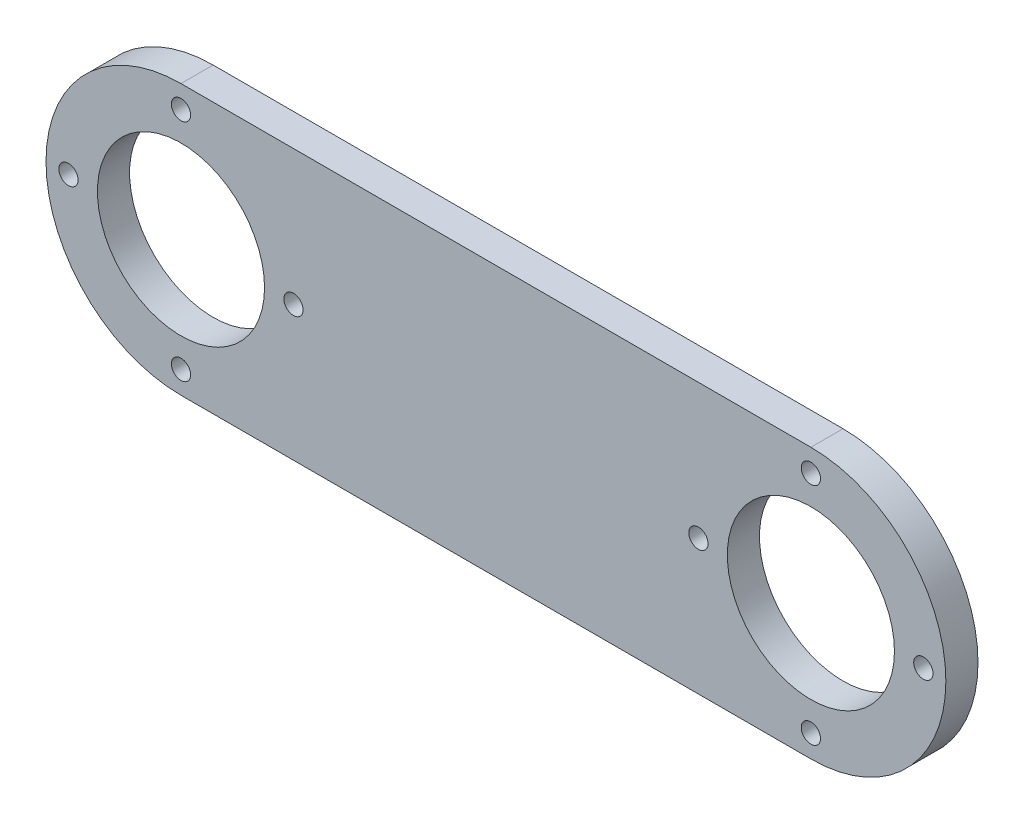
ISO-10303-21;
HEADER;
FILE_DESCRIPTION(('STEP AP214'),'2;1');
FILE_NAME('part.step','',(''),(''),'','','');
FILE_SCHEMA(('AUTOMOTIVE_DESIGN { 1 0 10303 214 1 1 1 1 }'));
ENDSEC;
DATA;
#1=APPLICATION_CONTEXT('core data for automotive mechanical design processes');
#2=APPLICATION_PROTOCOL_DEFINITION('international standard','automotive_design',2000,#1);
#3=PRODUCT_CONTEXT('',#1,'mechanical');
#4=PRODUCT('Part','Part','',(#3));
#5=PRODUCT_RELATED_PRODUCT_CATEGORY('part','',(#4));
#6=PRODUCT_DEFINITION_FORMATION('','',#4);
#7=PRODUCT_DEFINITION_CONTEXT('part definition',#1,'design');
#8=PRODUCT_DEFINITION('design','',#6,#7);
#9=PRODUCT_DEFINITION_SHAPE('','',#8);
#10=(LENGTH_UNIT() NAMED_UNIT(*) SI_UNIT(.MILLI.,.METRE.));
#11=(NAMED_UNIT(*) PLANE_ANGLE_UNIT() SI_UNIT($,.RADIAN.));
#12=(NAMED_UNIT(*) SI_UNIT($,.STERADIAN.) SOLID_ANGLE_UNIT());
#13=UNCERTAINTY_MEASURE_WITH_UNIT(LENGTH_MEASURE(1.E-05),#10,'distance_accuracy_value','');
#14=(GEOMETRIC_REPRESENTATION_CONTEXT(3) GLOBAL_UNCERTAINTY_ASSIGNED_CONTEXT((#13)) GLOBAL_UNIT_ASSIGNED_CONTEXT((#10,
#11,#12)) REPRESENTATION_CONTEXT('',''));
#15=CARTESIAN_POINT('',(0.,0.,0.));
#16=DIRECTION('',(0.,0.,1.));
#17=DIRECTION('',(1.,0.,0.));
#18=AXIS2_PLACEMENT_3D('',#15,#16,#17);
#19=CARTESIAN_POINT('',(-49.,4.99999999999989,5.));
#20=DIRECTION('',(0.,0.,1.));
#21=DIRECTION('',(1.,0.,0.));
#22=AXIS2_PLACEMENT_3D('',#19,#20,#21);
#23=PLANE('',#22);
#24=CARTESIAN_POINT('',(-49.,4.99999999999989,5.));
#25=DIRECTION('',(0.,0.,1.));
#26=DIRECTION('',(1.,0.,0.));
#27=AXIS2_PLACEMENT_3D('',#24,#25,#26);
#28=CIRCLE('',#27,13.0000000000001);
#29=CARTESIAN_POINT('',(-36.,4.99999999999989,5.));
#30=VERTEX_POINT('',#29);
#31=EDGE_CURVE('E190',#30,#30,#28,.T.);
#32=ORIENTED_EDGE('',*,*,#31,.F.);
#33=EDGE_LOOP('',(#32));
#34=FACE_BOUND('',#33,.T.);
#35=CARTESIAN_POINT('',(-66.5,5.,5.));
#36=DIRECTION('',(0.,0.,1.));
#37=DIRECTION('',(1.,0.,0.));
#38=AXIS2_PLACEMENT_3D('',#35,#36,#37);
#39=CIRCLE('',#38,1.5);
#40=CARTESIAN_POINT('',(-65.,5.,5.));
#41=VERTEX_POINT('',#40);
#42=EDGE_CURVE('E174',#41,#41,#39,.T.);
#43=ORIENTED_EDGE('',*,*,#42,.F.);
#44=EDGE_LOOP('',(#43));
#45=FACE_BOUND('',#44,.T.);
#46=CARTESIAN_POINT('',(-49.,-12.5,5.));
#47=DIRECTION('',(0.,0.,1.));
#48=DIRECTION('',(1.,0.,0.));
#49=AXIS2_PLACEMENT_3D('',#46,#47,#48);
#50=CIRCLE('',#49,1.5);
#51=CARTESIAN_POINT('',(-47.5,-12.5,5.));
#52=VERTEX_POINT('',#51);
#53=EDGE_CURVE('E158',#52,#52,#50,.T.);
#54=ORIENTED_EDGE('',*,*,#53,.F.);
#55=EDGE_LOOP('',(#54));
#56=FACE_BOUND('',#55,.T.);
#57=CARTESIAN_POINT('',(31.5,5.,5.));
#58=DIRECTION('',(0.,0.,1.));
#59=DIRECTION('',(1.,0.,0.));
#60=AXIS2_PLACEMENT_3D('',#57,#58,#59);
#61=CIRCLE('',#60,1.5);
#62=CARTESIAN_POINT('',(33.,5.,5.));
#63=VERTEX_POINT('',#62);
#64=EDGE_CURVE('E142',#63,#63,#61,.T.);
#65=ORIENTED_EDGE('',*,*,#64,.F.);
#66=EDGE_LOOP('',(#65));
#67=FACE_BOUND('',#66,.T.);
#68=CARTESIAN_POINT('',(49.,-12.5,5.));
#69=DIRECTION('',(0.,0.,1.));
#70=DIRECTION('',(1.,0.,0.));
#71=AXIS2_PLACEMENT_3D('',#68,#69,#70);
#72=CIRCLE('',#71,1.5);
#73=CARTESIAN_POINT('',(50.5,-12.5,5.));
#74=VERTEX_POINT('',#73);
#75=EDGE_CURVE('E112',#74,#74,#72,.T.);
#76=ORIENTED_EDGE('',*,*,#75,.F.);
#77=EDGE_LOOP('',(#76));
#78=FACE_BOUND('',#77,.T.);
#79=CARTESIAN_POINT('',(-49.,4.99999999999989,5.));
#80=DIRECTION('',(0.,0.,1.));
#81=DIRECTION('',(1.,0.,0.));
#82=AXIS2_PLACEMENT_3D('',#79,#80,#81);
#83=CIRCLE('',#82,21.);
#84=CARTESIAN_POINT('',(-49.,25.9999999999999,5.));
#85=VERTEX_POINT('',#84);
#86=CARTESIAN_POINT('',(-49.,-16.0000000000001,5.));
#87=VERTEX_POINT('',#86);
#88=EDGE_CURVE('E92',#85,#87,#83,.T.);
#89=ORIENTED_EDGE('',*,*,#88,.T.);
#90=DIRECTION('',(1.,0.,0.));
#91=VECTOR('',#90,1.);
#92=CARTESIAN_POINT('',(-49.,-16.0000000000001,5.));
#93=LINE('',#92,#91);
#94=CARTESIAN_POINT('',(49.,-16.,5.));
#95=VERTEX_POINT('',#94);
#96=EDGE_CURVE('E87',#87,#95,#93,.T.);
#97=ORIENTED_EDGE('',*,*,#96,.T.);
#98=CARTESIAN_POINT('',(49.,5.,5.));
#99=DIRECTION('',(0.,0.,1.));
#100=DIRECTION('',(1.,0.,0.));
#101=AXIS2_PLACEMENT_3D('',#98,#99,#100);
#102=CIRCLE('',#101,21.);
#103=CARTESIAN_POINT('',(49.,26.,5.));
#104=VERTEX_POINT('',#103);
#105=EDGE_CURVE('E90',#95,#104,#102,.T.);
#106=ORIENTED_EDGE('',*,*,#105,.T.);
#107=DIRECTION('',(-1.,0.,0.));
#108=VECTOR('',#107,1.);
#109=CARTESIAN_POINT('',(-49.,25.9999999999999,5.));
#110=LINE('',#109,#108);
#111=EDGE_CURVE('E57',#104,#85,#110,.T.);
#112=ORIENTED_EDGE('',*,*,#111,.T.);
#113=EDGE_LOOP('',(#89,#97,#106,#112));
#114=FACE_BOUND('',#113,.T.);
#115=CARTESIAN_POINT('',(66.5,5.,5.));
#116=DIRECTION('',(0.,0.,1.));
#117=DIRECTION('',(1.,0.,0.));
#118=AXIS2_PLACEMENT_3D('',#115,#116,#117);
#119=CIRCLE('',#118,1.5);
#120=CARTESIAN_POINT('',(68.,5.,5.));
#121=VERTEX_POINT('',#120);
#122=EDGE_CURVE('E134',#121,#121,#119,.T.);
#123=ORIENTED_EDGE('',*,*,#122,.F.);
#124=EDGE_LOOP('',(#123));
#125=FACE_BOUND('',#124,.T.);
#126=CARTESIAN_POINT('',(49.,22.5,5.));
#127=DIRECTION('',(0.,0.,1.));
#128=DIRECTION('',(1.,0.,0.));
#129=AXIS2_PLACEMENT_3D('',#126,#127,#128);
#130=CIRCLE('',#129,1.5);
#131=CARTESIAN_POINT('',(50.5,22.5,5.));
#132=VERTEX_POINT('',#131);
#133=EDGE_CURVE('E150',#132,#132,#130,.T.);
#134=ORIENTED_EDGE('',*,*,#133,.F.);
#135=EDGE_LOOP('',(#134));
#136=FACE_BOUND('',#135,.T.);
#137=CARTESIAN_POINT('',(-31.5,5.,5.));
#138=DIRECTION('',(0.,0.,1.));
#139=DIRECTION('',(1.,0.,0.));
#140=AXIS2_PLACEMENT_3D('',#137,#138,#139);
#141=CIRCLE('',#140,1.5);
#142=CARTESIAN_POINT('',(-30.,5.,5.));
#143=VERTEX_POINT('',#142);
#144=EDGE_CURVE('E166',#143,#143,#141,.T.);
#145=ORIENTED_EDGE('',*,*,#144,.F.);
#146=EDGE_LOOP('',(#145));
#147=FACE_BOUND('',#146,.T.);
#148=CARTESIAN_POINT('',(-49.,22.5,5.));
#149=DIRECTION('',(0.,0.,1.));
#150=DIRECTION('',(1.,0.,0.));
#151=AXIS2_PLACEMENT_3D('',#148,#149,#150);
#152=CIRCLE('',#151,1.5);
#153=CARTESIAN_POINT('',(-47.5,22.5,5.));
#154=VERTEX_POINT('',#153);
#155=EDGE_CURVE('E182',#154,#154,#152,.T.);
#156=ORIENTED_EDGE('',*,*,#155,.F.);
#157=EDGE_LOOP('',(#156));
#158=FACE_BOUND('',#157,.T.);
#159=CARTESIAN_POINT('',(49.,5.,5.));
#160=DIRECTION('',(0.,0.,1.));
#161=DIRECTION('',(1.,0.,0.));
#162=AXIS2_PLACEMENT_3D('',#159,#160,#161);
#163=CIRCLE('',#162,13.);
#164=CARTESIAN_POINT('',(62.,5.,5.));
#165=VERTEX_POINT('',#164);
#166=EDGE_CURVE('E198',#165,#165,#163,.T.);
#167=ORIENTED_EDGE('',*,*,#166,.F.);
#168=EDGE_LOOP('',(#167));
#169=FACE_BOUND('',#168,.T.);
#170=ADVANCED_FACE('F39',(#34,#45,#56,#67,#78,#114,#125,#136,#147,#158,#169),#23,.T.);
#171=CARTESIAN_POINT('',(-49.,4.99999999999989,0.));
#172=DIRECTION('',(0.,0.,1.));
#173=DIRECTION('',(1.,0.,0.));
#174=AXIS2_PLACEMENT_3D('',#171,#172,#173);
#175=PLANE('',#174);
#176=CARTESIAN_POINT('',(-49.,4.99999999999989,0.));
#177=DIRECTION('',(0.,0.,1.));
#178=DIRECTION('',(1.,0.,0.));
#179=AXIS2_PLACEMENT_3D('',#176,#177,#178);
#180=CIRCLE('',#179,21.);
#181=CARTESIAN_POINT('',(-49.,25.9999999999999,0.));
#182=VERTEX_POINT('',#181);
#183=CARTESIAN_POINT('',(-49.,-16.0000000000001,0.));
#184=VERTEX_POINT('',#183);
#185=EDGE_CURVE('E108',#182,#184,#180,.T.);
#186=ORIENTED_EDGE('',*,*,#185,.F.);
#187=DIRECTION('',(-1.,0.,0.));
#188=VECTOR('',#187,1.);
#189=CARTESIAN_POINT('',(-49.,25.9999999999999,0.));
#190=LINE('',#189,#188);
#191=CARTESIAN_POINT('',(49.,26.,0.));
#192=VERTEX_POINT('',#191);
#193=EDGE_CURVE('E80',#192,#182,#190,.T.);
#194=ORIENTED_EDGE('',*,*,#193,.F.);
#195=CARTESIAN_POINT('',(49.,5.,0.));
#196=DIRECTION('',(0.,0.,1.));
#197=DIRECTION('',(1.,0.,0.));
#198=AXIS2_PLACEMENT_3D('',#195,#196,#197);
#199=CIRCLE('',#198,21.);
#200=CARTESIAN_POINT('',(49.,-16.,0.));
#201=VERTEX_POINT('',#200);
#202=EDGE_CURVE('E74',#201,#192,#199,.T.);
#203=ORIENTED_EDGE('',*,*,#202,.F.);
#204=DIRECTION('',(1.,0.,0.));
#205=VECTOR('',#204,1.);
#206=CARTESIAN_POINT('',(-49.,-16.0000000000001,0.));
#207=LINE('',#206,#205);
#208=EDGE_CURVE('E97',#184,#201,#207,.T.);
#209=ORIENTED_EDGE('',*,*,#208,.F.);
#210=EDGE_LOOP('',(#186,#194,#203,#209));
#211=FACE_BOUND('',#210,.T.);
#212=CARTESIAN_POINT('',(49.,-12.5,0.));
#213=DIRECTION('',(0.,0.,1.));
#214=DIRECTION('',(1.,0.,0.));
#215=AXIS2_PLACEMENT_3D('',#212,#213,#214);
#216=CIRCLE('',#215,1.5);
#217=CARTESIAN_POINT('',(50.5,-12.5,0.));
#218=VERTEX_POINT('',#217);
#219=EDGE_CURVE('E130',#218,#218,#216,.T.);
#220=ORIENTED_EDGE('',*,*,#219,.T.);
#221=EDGE_LOOP('',(#220));
#222=FACE_BOUND('',#221,.T.);
#223=CARTESIAN_POINT('',(66.5,5.,0.));
#224=DIRECTION('',(0.,0.,1.));
#225=DIRECTION('',(1.,0.,0.));
#226=AXIS2_PLACEMENT_3D('',#223,#224,#225);
#227=CIRCLE('',#226,1.5);
#228=CARTESIAN_POINT('',(68.,5.,0.));
#229=VERTEX_POINT('',#228);
#230=EDGE_CURVE('E138',#229,#229,#227,.T.);
#231=ORIENTED_EDGE('',*,*,#230,.T.);
#232=EDGE_LOOP('',(#231));
#233=FACE_BOUND('',#232,.T.);
#234=CARTESIAN_POINT('',(31.5,5.,0.));
#235=DIRECTION('',(0.,0.,1.));
#236=DIRECTION('',(1.,0.,0.));
#237=AXIS2_PLACEMENT_3D('',#234,#235,#236);
#238=CIRCLE('',#237,1.5);
#239=CARTESIAN_POINT('',(33.,5.,0.));
#240=VERTEX_POINT('',#239);
#241=EDGE_CURVE('E146',#240,#240,#238,.T.);
#242=ORIENTED_EDGE('',*,*,#241,.T.);
#243=EDGE_LOOP('',(#242));
#244=FACE_BOUND('',#243,.T.);
#245=CARTESIAN_POINT('',(49.,22.5,0.));
#246=DIRECTION('',(0.,0.,1.));
#247=DIRECTION('',(1.,0.,0.));
#248=AXIS2_PLACEMENT_3D('',#245,#246,#247);
#249=CIRCLE('',#248,1.5);
#250=CARTESIAN_POINT('',(50.5,22.5,0.));
#251=VERTEX_POINT('',#250);
#252=EDGE_CURVE('E154',#251,#251,#249,.T.);
#253=ORIENTED_EDGE('',*,*,#252,.T.);
#254=EDGE_LOOP('',(#253));
#255=FACE_BOUND('',#254,.T.);
#256=CARTESIAN_POINT('',(-49.,-12.5,0.));
#257=DIRECTION('',(0.,0.,1.));
#258=DIRECTION('',(1.,0.,0.));
#259=AXIS2_PLACEMENT_3D('',#256,#257,#258);
#260=CIRCLE('',#259,1.5);
#261=CARTESIAN_POINT('',(-47.5,-12.5,0.));
#262=VERTEX_POINT('',#261);
#263=EDGE_CURVE('E162',#262,#262,#260,.T.);
#264=ORIENTED_EDGE('',*,*,#263,.T.);
#265=EDGE_LOOP('',(#264));
#266=FACE_BOUND('',#265,.T.);
#267=CARTESIAN_POINT('',(-31.5,5.,0.));
#268=DIRECTION('',(0.,0.,1.));
#269=DIRECTION('',(1.,0.,0.));
#270=AXIS2_PLACEMENT_3D('',#267,#268,#269);
#271=CIRCLE('',#270,1.5);
#272=CARTESIAN_POINT('',(-30.,5.,0.));
#273=VERTEX_POINT('',#272);
#274=EDGE_CURVE('E170',#273,#273,#271,.T.);
#275=ORIENTED_EDGE('',*,*,#274,.T.);
#276=EDGE_LOOP('',(#275));
#277=FACE_BOUND('',#276,.T.);
#278=CARTESIAN_POINT('',(-66.5,5.,0.));
#279=DIRECTION('',(0.,0.,1.));
#280=DIRECTION('',(1.,0.,0.));
#281=AXIS2_PLACEMENT_3D('',#278,#279,#280);
#282=CIRCLE('',#281,1.5);
#283=CARTESIAN_POINT('',(-65.,5.,0.));
#284=VERTEX_POINT('',#283);
#285=EDGE_CURVE('E178',#284,#284,#282,.T.);
#286=ORIENTED_EDGE('',*,*,#285,.T.);
#287=EDGE_LOOP('',(#286));
#288=FACE_BOUND('',#287,.T.);
#289=CARTESIAN_POINT('',(-49.,22.5,0.));
#290=DIRECTION('',(0.,0.,1.));
#291=DIRECTION('',(1.,0.,0.));
#292=AXIS2_PLACEMENT_3D('',#289,#290,#291);
#293=CIRCLE('',#292,1.5);
#294=CARTESIAN_POINT('',(-47.5,22.5,0.));
#295=VERTEX_POINT('',#294);
#296=EDGE_CURVE('E186',#295,#295,#293,.T.);
#297=ORIENTED_EDGE('',*,*,#296,.T.);
#298=EDGE_LOOP('',(#297));
#299=FACE_BOUND('',#298,.T.);
#300=CARTESIAN_POINT('',(-49.,4.99999999999989,0.));
#301=DIRECTION('',(0.,0.,1.));
#302=DIRECTION('',(1.,0.,0.));
#303=AXIS2_PLACEMENT_3D('',#300,#301,#302);
#304=CIRCLE('',#303,13.0000000000001);
#305=CARTESIAN_POINT('',(-36.,4.99999999999989,0.));
#306=VERTEX_POINT('',#305);
#307=EDGE_CURVE('E194',#306,#306,#304,.T.);
#308=ORIENTED_EDGE('',*,*,#307,.T.);
#309=EDGE_LOOP('',(#308));
#310=FACE_BOUND('',#309,.T.);
#311=CARTESIAN_POINT('',(49.,5.,0.));
#312=DIRECTION('',(0.,0.,1.));
#313=DIRECTION('',(1.,0.,0.));
#314=AXIS2_PLACEMENT_3D('',#311,#312,#313);
#315=CIRCLE('',#314,13.);
#316=CARTESIAN_POINT('',(62.,5.,0.));
#317=VERTEX_POINT('',#316);
#318=EDGE_CURVE('E202',#317,#317,#315,.T.);
#319=ORIENTED_EDGE('',*,*,#318,.T.);
#320=EDGE_LOOP('',(#319));
#321=FACE_BOUND('',#320,.T.);
#322=ADVANCED_FACE('F125',(#211,#222,#233,#244,#255,#266,#277,#288,#299,#310,#321),#175,.F.);
#323=CARTESIAN_POINT('',(-49.,4.99999999999989,5.));
#324=DIRECTION('',(0.,0.,-1.));
#325=DIRECTION('',(-1.,0.,0.));
#326=AXIS2_PLACEMENT_3D('',#323,#324,#325);
#327=CYLINDRICAL_SURFACE('',#326,21.);
#328=ORIENTED_EDGE('',*,*,#185,.T.);
#329=DIRECTION('',(0.,0.,-1.));
#330=VECTOR('',#329,1.);
#331=CARTESIAN_POINT('',(-49.,-16.0000000000001,5.));
#332=LINE('',#331,#330);
#333=EDGE_CURVE('E11',#87,#184,#332,.T.);
#334=ORIENTED_EDGE('',*,*,#333,.F.);
#335=ORIENTED_EDGE('',*,*,#88,.F.);
#336=DIRECTION('',(0.,0.,-1.));
#337=VECTOR('',#336,1.);
#338=CARTESIAN_POINT('',(-49.,25.9999999999999,5.));
#339=LINE('',#338,#337);
#340=EDGE_CURVE('E104',#85,#182,#339,.T.);
#341=ORIENTED_EDGE('',*,*,#340,.T.);
#342=EDGE_LOOP('',(#328,#334,#335,#341));
#343=FACE_BOUND('',#342,.T.);
#344=ADVANCED_FACE('F41',(#343),#327,.T.);
#345=CARTESIAN_POINT('',(-49.,-16.0000000000001,5.));
#346=DIRECTION('',(0.,1.,0.));
#347=DIRECTION('',(-1.,0.,0.));
#348=AXIS2_PLACEMENT_3D('',#345,#346,#347);
#349=PLANE('',#348);
#350=ORIENTED_EDGE('',*,*,#208,.T.);
#351=DIRECTION('',(0.,0.,-1.));
#352=VECTOR('',#351,1.);
#353=CARTESIAN_POINT('',(49.,-16.,5.));
#354=LINE('',#353,#352);
#355=EDGE_CURVE('E49',#95,#201,#354,.T.);
#356=ORIENTED_EDGE('',*,*,#355,.F.);
#357=ORIENTED_EDGE('',*,*,#96,.F.);
#358=ORIENTED_EDGE('',*,*,#333,.T.);
#359=EDGE_LOOP('',(#350,#356,#357,#358));
#360=FACE_BOUND('',#359,.T.);
#361=ADVANCED_FACE('F96',(#360),#349,.F.);
#362=CARTESIAN_POINT('',(49.,5.,5.));
#363=DIRECTION('',(0.,0.,-1.));
#364=DIRECTION('',(-1.,0.,0.));
#365=AXIS2_PLACEMENT_3D('',#362,#363,#364);
#366=CYLINDRICAL_SURFACE('',#365,21.);
#367=ORIENTED_EDGE('',*,*,#202,.T.);
#368=DIRECTION('',(0.,0.,-1.));
#369=VECTOR('',#368,1.);
#370=CARTESIAN_POINT('',(49.,26.,5.));
#371=LINE('',#370,#369);
#372=EDGE_CURVE('E99',#104,#192,#371,.T.);
#373=ORIENTED_EDGE('',*,*,#372,.F.);
#374=ORIENTED_EDGE('',*,*,#105,.F.);
#375=ORIENTED_EDGE('',*,*,#355,.T.);
#376=EDGE_LOOP('',(#367,#373,#374,#375));
#377=FACE_BOUND('',#376,.T.);
#378=ADVANCED_FACE('F100',(#377),#366,.T.);
#379=CARTESIAN_POINT('',(-49.,25.9999999999999,5.));
#380=DIRECTION('',(0.,-1.,0.));
#381=DIRECTION('',(1.,0.,0.));
#382=AXIS2_PLACEMENT_3D('',#379,#380,#381);
#383=PLANE('',#382);
#384=ORIENTED_EDGE('',*,*,#193,.T.);
#385=ORIENTED_EDGE('',*,*,#340,.F.);
#386=ORIENTED_EDGE('',*,*,#111,.F.);
#387=ORIENTED_EDGE('',*,*,#372,.T.);
#388=EDGE_LOOP('',(#384,#385,#386,#387));
#389=FACE_BOUND('',#388,.T.);
#390=ADVANCED_FACE('F122',(#389),#383,.F.);
#391=CARTESIAN_POINT('',(49.,-12.5,5.));
#392=DIRECTION('',(0.,0.,-1.));
#393=DIRECTION('',(-1.,0.,0.));
#394=AXIS2_PLACEMENT_3D('',#391,#392,#393);
#395=CYLINDRICAL_SURFACE('',#394,1.5);
#396=ORIENTED_EDGE('',*,*,#75,.T.);
#397=EDGE_LOOP('',(#396));
#398=FACE_BOUND('',#397,.T.);
#399=ORIENTED_EDGE('',*,*,#219,.F.);
#400=EDGE_LOOP('',(#399));
#401=FACE_BOUND('',#400,.T.);
#402=ADVANCED_FACE('F223',(#398,#401),#395,.F.);
#403=CARTESIAN_POINT('',(66.5,5.,5.));
#404=DIRECTION('',(0.,0.,-1.));
#405=DIRECTION('',(-1.,0.,0.));
#406=AXIS2_PLACEMENT_3D('',#403,#404,#405);
#407=CYLINDRICAL_SURFACE('',#406,1.5);
#408=ORIENTED_EDGE('',*,*,#122,.T.);
#409=EDGE_LOOP('',(#408));
#410=FACE_BOUND('',#409,.T.);
#411=ORIENTED_EDGE('',*,*,#230,.F.);
#412=EDGE_LOOP('',(#411));
#413=FACE_BOUND('',#412,.T.);
#414=ADVANCED_FACE('F269',(#410,#413),#407,.F.);
#415=CARTESIAN_POINT('',(31.5,5.,5.));
#416=DIRECTION('',(0.,0.,-1.));
#417=DIRECTION('',(-1.,0.,0.));
#418=AXIS2_PLACEMENT_3D('',#415,#416,#417);
#419=CYLINDRICAL_SURFACE('',#418,1.5);
#420=ORIENTED_EDGE('',*,*,#64,.T.);
#421=EDGE_LOOP('',(#420));
#422=FACE_BOUND('',#421,.T.);
#423=ORIENTED_EDGE('',*,*,#241,.F.);
#424=EDGE_LOOP('',(#423));
#425=FACE_BOUND('',#424,.T.);
#426=ADVANCED_FACE('F277',(#422,#425),#419,.F.);
#427=CARTESIAN_POINT('',(49.,22.5,5.));
#428=DIRECTION('',(0.,0.,-1.));
#429=DIRECTION('',(-1.,0.,0.));
#430=AXIS2_PLACEMENT_3D('',#427,#428,#429);
#431=CYLINDRICAL_SURFACE('',#430,1.5);
#432=ORIENTED_EDGE('',*,*,#133,.T.);
#433=EDGE_LOOP('',(#432));
#434=FACE_BOUND('',#433,.T.);
#435=ORIENTED_EDGE('',*,*,#252,.F.);
#436=EDGE_LOOP('',(#435));
#437=FACE_BOUND('',#436,.T.);
#438=ADVANCED_FACE('F285',(#434,#437),#431,.F.);
#439=CARTESIAN_POINT('',(-49.,-12.5,5.));
#440=DIRECTION('',(0.,0.,-1.));
#441=DIRECTION('',(-1.,0.,0.));
#442=AXIS2_PLACEMENT_3D('',#439,#440,#441);
#443=CYLINDRICAL_SURFACE('',#442,1.5);
#444=ORIENTED_EDGE('',*,*,#53,.T.);
#445=EDGE_LOOP('',(#444));
#446=FACE_BOUND('',#445,.T.);
#447=ORIENTED_EDGE('',*,*,#263,.F.);
#448=EDGE_LOOP('',(#447));
#449=FACE_BOUND('',#448,.T.);
#450=ADVANCED_FACE('F294',(#446,#449),#443,.F.);
#451=CARTESIAN_POINT('',(-31.5,5.,5.));
#452=DIRECTION('',(0.,0.,-1.));
#453=DIRECTION('',(-1.,0.,0.));
#454=AXIS2_PLACEMENT_3D('',#451,#452,#453);
#455=CYLINDRICAL_SURFACE('',#454,1.5);
#456=ORIENTED_EDGE('',*,*,#144,.T.);
#457=EDGE_LOOP('',(#456));
#458=FACE_BOUND('',#457,.T.);
#459=ORIENTED_EDGE('',*,*,#274,.F.);
#460=EDGE_LOOP('',(#459));
#461=FACE_BOUND('',#460,.T.);
#462=ADVANCED_FACE('F303',(#458,#461),#455,.F.);
#463=CARTESIAN_POINT('',(-66.5,5.,5.));
#464=DIRECTION('',(0.,0.,-1.));
#465=DIRECTION('',(-1.,0.,0.));
#466=AXIS2_PLACEMENT_3D('',#463,#464,#465);
#467=CYLINDRICAL_SURFACE('',#466,1.5);
#468=ORIENTED_EDGE('',*,*,#42,.T.);
#469=EDGE_LOOP('',(#468));
#470=FACE_BOUND('',#469,.T.);
#471=ORIENTED_EDGE('',*,*,#285,.F.);
#472=EDGE_LOOP('',(#471));
#473=FACE_BOUND('',#472,.T.);
#474=ADVANCED_FACE('F312',(#470,#473),#467,.F.);
#475=CARTESIAN_POINT('',(-49.,22.5,5.));
#476=DIRECTION('',(0.,0.,-1.));
#477=DIRECTION('',(-1.,0.,0.));
#478=AXIS2_PLACEMENT_3D('',#475,#476,#477);
#479=CYLINDRICAL_SURFACE('',#478,1.5);
#480=ORIENTED_EDGE('',*,*,#155,.T.);
#481=EDGE_LOOP('',(#480));
#482=FACE_BOUND('',#481,.T.);
#483=ORIENTED_EDGE('',*,*,#296,.F.);
#484=EDGE_LOOP('',(#483));
#485=FACE_BOUND('',#484,.T.);
#486=ADVANCED_FACE('F321',(#482,#485),#479,.F.);
#487=CARTESIAN_POINT('',(-49.,4.99999999999989,5.));
#488=DIRECTION('',(0.,0.,-1.));
#489=DIRECTION('',(-1.,0.,0.));
#490=AXIS2_PLACEMENT_3D('',#487,#488,#489);
#491=CYLINDRICAL_SURFACE('',#490,13.0000000000001);
#492=ORIENTED_EDGE('',*,*,#31,.T.);
#493=EDGE_LOOP('',(#492));
#494=FACE_BOUND('',#493,.T.);
#495=ORIENTED_EDGE('',*,*,#307,.F.);
#496=EDGE_LOOP('',(#495));
#497=FACE_BOUND('',#496,.T.);
#498=ADVANCED_FACE('F330',(#494,#497),#491,.F.);
#499=CARTESIAN_POINT('',(49.,5.,5.));
#500=DIRECTION('',(0.,0.,-1.));
#501=DIRECTION('',(-1.,0.,0.));
#502=AXIS2_PLACEMENT_3D('',#499,#500,#501);
#503=CYLINDRICAL_SURFACE('',#502,13.);
#504=ORIENTED_EDGE('',*,*,#166,.T.);
#505=EDGE_LOOP('',(#504));
#506=FACE_BOUND('',#505,.T.);
#507=ORIENTED_EDGE('',*,*,#318,.F.);
#508=EDGE_LOOP('',(#507));
#509=FACE_BOUND('',#508,.T.);
#510=ADVANCED_FACE('F210',(#506,#509),#503,.F.);
#511=CLOSED_SHELL('',(#170,#322,#344,#361,#378,#390,#402,#414,#426,#438,#450,#462,#474,#486,
#498,#510));
#512=MANIFOLD_SOLID_BREP('B2',#511);
#513=ADVANCED_BREP_SHAPE_REPRESENTATION('',(#18,#512),#14);
#514=SHAPE_DEFINITION_REPRESENTATION(#9,#513);
ENDSEC;
END-ISO-10303-21;
